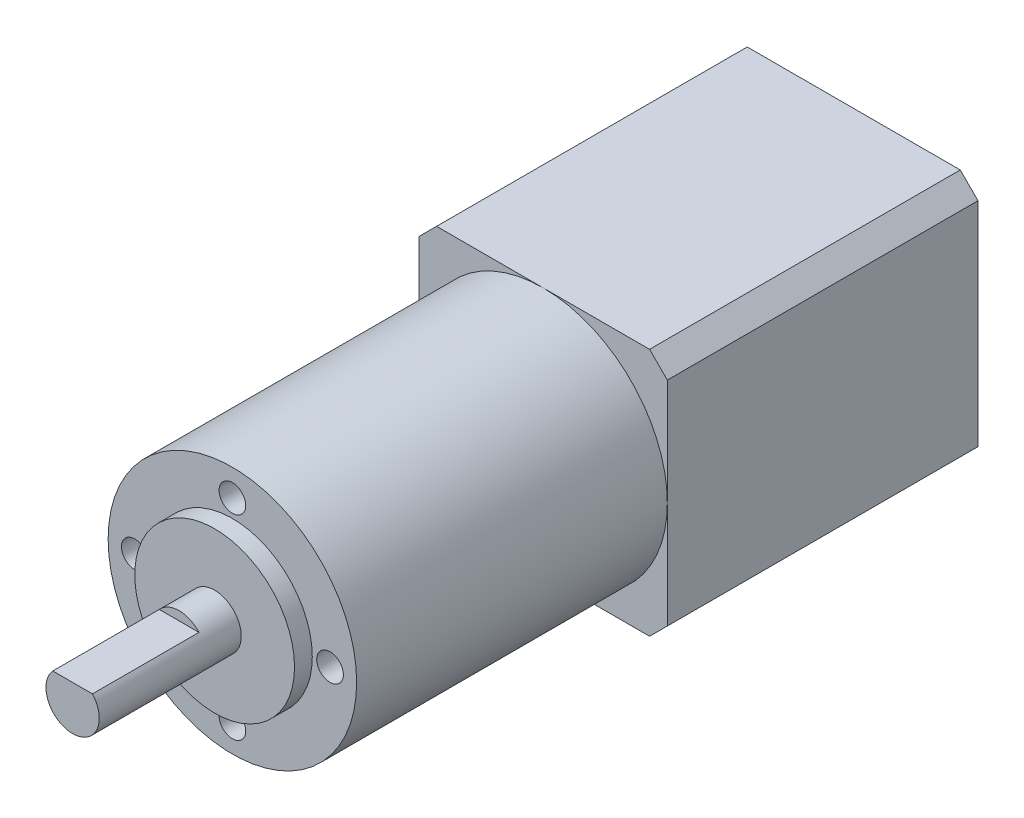
ISO-10303-21;
HEADER;
FILE_DESCRIPTION(('STEP AP214'),'2;1');
FILE_NAME('part.step','',(''),(''),'','','');
FILE_SCHEMA(('AUTOMOTIVE_DESIGN { 1 0 10303 214 1 1 1 1 }'));
ENDSEC;
DATA;
#1=APPLICATION_CONTEXT('core data for automotive mechanical design processes');
#2=APPLICATION_PROTOCOL_DEFINITION('international standard','automotive_design',2000,#1);
#3=PRODUCT_CONTEXT('',#1,'mechanical');
#4=PRODUCT('Part','Part','',(#3));
#5=PRODUCT_RELATED_PRODUCT_CATEGORY('part','',(#4));
#6=PRODUCT_DEFINITION_FORMATION('','',#4);
#7=PRODUCT_DEFINITION_CONTEXT('part definition',#1,'design');
#8=PRODUCT_DEFINITION('design','',#6,#7);
#9=PRODUCT_DEFINITION_SHAPE('','',#8);
#10=(LENGTH_UNIT() NAMED_UNIT(*) SI_UNIT(.MILLI.,.METRE.));
#11=(NAMED_UNIT(*) PLANE_ANGLE_UNIT() SI_UNIT($,.RADIAN.));
#12=(NAMED_UNIT(*) SI_UNIT($,.STERADIAN.) SOLID_ANGLE_UNIT());
#13=UNCERTAINTY_MEASURE_WITH_UNIT(LENGTH_MEASURE(1.E-05),#10,'distance_accuracy_value','');
#14=(GEOMETRIC_REPRESENTATION_CONTEXT(3) GLOBAL_UNCERTAINTY_ASSIGNED_CONTEXT((#13)) GLOBAL_UNIT_ASSIGNED_CONTEXT((#10,
#11,#12)) REPRESENTATION_CONTEXT('',''));
#15=CARTESIAN_POINT('',(0.,0.,0.));
#16=DIRECTION('',(0.,0.,1.));
#17=DIRECTION('',(1.,0.,0.));
#18=AXIS2_PLACEMENT_3D('',#15,#16,#17);
#19=CARTESIAN_POINT('',(0.,0.,35.));
#20=DIRECTION('',(0.,0.,-1.));
#21=DIRECTION('',(-1.,0.,0.));
#22=AXIS2_PLACEMENT_3D('',#19,#20,#21);
#23=PLANE('',#22);
#24=DIRECTION('',(0.,1.,0.));
#25=VECTOR('',#24,1.);
#26=CARTESIAN_POINT('',(14.,-14.,35.));
#27=LINE('',#26,#25);
#28=CARTESIAN_POINT('',(14.,0.,35.));
#29=VERTEX_POINT('',#28);
#30=CARTESIAN_POINT('',(14.,12.,35.));
#31=VERTEX_POINT('',#30);
#32=EDGE_CURVE('E176',#29,#31,#27,.T.);
#33=ORIENTED_EDGE('',*,*,#32,.T.);
#34=DIRECTION('',(0.707106781186545,-0.70710678118655,0.));
#35=VECTOR('',#34,1.);
#36=CARTESIAN_POINT('',(12.,14.,35.));
#37=LINE('',#36,#35);
#38=CARTESIAN_POINT('',(12.,14.,35.));
#39=VERTEX_POINT('',#38);
#40=EDGE_CURVE('E219',#31,#39,#37,.F.);
#41=ORIENTED_EDGE('',*,*,#40,.T.);
#42=DIRECTION('',(-1.,0.,0.));
#43=VECTOR('',#42,1.);
#44=CARTESIAN_POINT('',(-14.,14.,35.));
#45=LINE('',#44,#43);
#46=CARTESIAN_POINT('',(0.,14.,35.));
#47=VERTEX_POINT('',#46);
#48=EDGE_CURVE('E177',#39,#47,#45,.T.);
#49=ORIENTED_EDGE('',*,*,#48,.T.);
#50=CARTESIAN_POINT('',(0.,0.,35.));
#51=DIRECTION('',(0.,0.,1.));
#52=DIRECTION('',(1.,0.,0.));
#53=AXIS2_PLACEMENT_3D('',#50,#51,#52);
#54=CIRCLE('',#53,14.);
#55=EDGE_CURVE('E162',#29,#47,#54,.T.);
#56=ORIENTED_EDGE('',*,*,#55,.F.);
#57=EDGE_LOOP('',(#33,#41,#49,#56));
#58=FACE_BOUND('',#57,.T.);
#59=ADVANCED_FACE('F38',(#58),#23,.F.);
#60=CARTESIAN_POINT('',(-12.,14.,35.));
#61=VERTEX_POINT('',#60);
#62=EDGE_CURVE('E175',#47,#61,#45,.T.);
#63=ORIENTED_EDGE('',*,*,#62,.T.);
#64=DIRECTION('',(0.70710678118655,0.707106781186545,0.));
#65=VECTOR('',#64,1.);
#66=CARTESIAN_POINT('',(-14.,12.,35.));
#67=LINE('',#66,#65);
#68=CARTESIAN_POINT('',(-14.,12.,35.));
#69=VERTEX_POINT('',#68);
#70=EDGE_CURVE('E11',#61,#69,#67,.F.);
#71=ORIENTED_EDGE('',*,*,#70,.T.);
#72=DIRECTION('',(0.,-1.,0.));
#73=VECTOR('',#72,1.);
#74=CARTESIAN_POINT('',(-14.,-14.,35.));
#75=LINE('',#74,#73);
#76=CARTESIAN_POINT('',(-14.,0.,35.));
#77=VERTEX_POINT('',#76);
#78=EDGE_CURVE('E180',#69,#77,#75,.T.);
#79=ORIENTED_EDGE('',*,*,#78,.T.);
#80=EDGE_CURVE('E165',#47,#77,#54,.T.);
#81=ORIENTED_EDGE('',*,*,#80,.F.);
#82=EDGE_LOOP('',(#63,#71,#79,#81));
#83=FACE_BOUND('',#82,.T.);
#84=ADVANCED_FACE('F276',(#83),#23,.F.);
#85=CARTESIAN_POINT('',(-14.,-12.,35.));
#86=VERTEX_POINT('',#85);
#87=EDGE_CURVE('E179',#77,#86,#75,.T.);
#88=ORIENTED_EDGE('',*,*,#87,.T.);
#89=DIRECTION('',(-0.707106781186545,0.70710678118655,0.));
#90=VECTOR('',#89,1.);
#91=CARTESIAN_POINT('',(-12.,-14.,35.));
#92=LINE('',#91,#90);
#93=CARTESIAN_POINT('',(-12.,-14.,35.));
#94=VERTEX_POINT('',#93);
#95=EDGE_CURVE('E47',#86,#94,#92,.F.);
#96=ORIENTED_EDGE('',*,*,#95,.T.);
#97=DIRECTION('',(1.,0.,0.));
#98=VECTOR('',#97,1.);
#99=CARTESIAN_POINT('',(-14.,-14.,35.));
#100=LINE('',#99,#98);
#101=CARTESIAN_POINT('',(0.,-14.,35.));
#102=VERTEX_POINT('',#101);
#103=EDGE_CURVE('E183',#94,#102,#100,.T.);
#104=ORIENTED_EDGE('',*,*,#103,.T.);
#105=EDGE_CURVE('E271',#77,#102,#54,.T.);
#106=ORIENTED_EDGE('',*,*,#105,.F.);
#107=EDGE_LOOP('',(#88,#96,#104,#106));
#108=FACE_BOUND('',#107,.T.);
#109=ADVANCED_FACE('F227',(#108),#23,.F.);
#110=CARTESIAN_POINT('',(14.,-14.,35.));
#111=DIRECTION('',(-1.,0.,0.));
#112=DIRECTION('',(0.,0.,1.));
#113=AXIS2_PLACEMENT_3D('',#110,#111,#112);
#114=PLANE('',#113);
#115=CARTESIAN_POINT('',(14.,-12.,35.));
#116=VERTEX_POINT('',#115);
#117=EDGE_CURVE('E173',#116,#29,#27,.T.);
#118=ORIENTED_EDGE('',*,*,#117,.F.);
#119=DIRECTION('',(0.,0.,-1.));
#120=VECTOR('',#119,1.);
#121=CARTESIAN_POINT('',(14.,-12.,35.));
#122=LINE('',#121,#120);
#123=CARTESIAN_POINT('',(14.,-12.,0.));
#124=VERTEX_POINT('',#123);
#125=EDGE_CURVE('E196',#116,#124,#122,.T.);
#126=ORIENTED_EDGE('',*,*,#125,.T.);
#127=DIRECTION('',(0.,1.,0.));
#128=VECTOR('',#127,1.);
#129=CARTESIAN_POINT('',(14.,-14.,0.));
#130=LINE('',#129,#128);
#131=CARTESIAN_POINT('',(14.,12.,0.));
#132=VERTEX_POINT('',#131);
#133=EDGE_CURVE('E169',#124,#132,#130,.T.);
#134=ORIENTED_EDGE('',*,*,#133,.T.);
#135=DIRECTION('',(0.,0.,1.));
#136=VECTOR('',#135,1.);
#137=CARTESIAN_POINT('',(14.,12.,35.));
#138=LINE('',#137,#136);
#139=EDGE_CURVE('E158',#132,#31,#138,.T.);
#140=ORIENTED_EDGE('',*,*,#139,.T.);
#141=ORIENTED_EDGE('',*,*,#32,.F.);
#142=EDGE_LOOP('',(#118,#126,#134,#140,#141));
#143=FACE_BOUND('',#142,.T.);
#144=ADVANCED_FACE('F259',(#143),#114,.F.);
#145=CARTESIAN_POINT('',(-14.,14.,35.));
#146=DIRECTION('',(0.,-1.,0.));
#147=DIRECTION('',(1.,0.,0.));
#148=AXIS2_PLACEMENT_3D('',#145,#146,#147);
#149=PLANE('',#148);
#150=ORIENTED_EDGE('',*,*,#48,.F.);
#151=DIRECTION('',(0.,0.,-1.));
#152=VECTOR('',#151,1.);
#153=CARTESIAN_POINT('',(12.,14.,35.));
#154=LINE('',#153,#152);
#155=CARTESIAN_POINT('',(12.,14.,0.));
#156=VERTEX_POINT('',#155);
#157=EDGE_CURVE('E216',#39,#156,#154,.T.);
#158=ORIENTED_EDGE('',*,*,#157,.T.);
#159=DIRECTION('',(-1.,0.,0.));
#160=VECTOR('',#159,1.);
#161=CARTESIAN_POINT('',(-14.,14.,0.));
#162=LINE('',#161,#160);
#163=CARTESIAN_POINT('',(-12.,14.,0.));
#164=VERTEX_POINT('',#163);
#165=EDGE_CURVE('E187',#156,#164,#162,.T.);
#166=ORIENTED_EDGE('',*,*,#165,.T.);
#167=DIRECTION('',(0.,0.,1.));
#168=VECTOR('',#167,1.);
#169=CARTESIAN_POINT('',(-12.,14.,35.));
#170=LINE('',#169,#168);
#171=EDGE_CURVE('E214',#164,#61,#170,.T.);
#172=ORIENTED_EDGE('',*,*,#171,.T.);
#173=ORIENTED_EDGE('',*,*,#62,.F.);
#174=EDGE_LOOP('',(#150,#158,#166,#172,#173));
#175=FACE_BOUND('',#174,.T.);
#176=ADVANCED_FACE('F250',(#175),#149,.F.);
#177=CARTESIAN_POINT('',(-14.,-14.,35.));
#178=DIRECTION('',(1.,0.,0.));
#179=DIRECTION('',(0.,0.,-1.));
#180=AXIS2_PLACEMENT_3D('',#177,#178,#179);
#181=PLANE('',#180);
#182=DIRECTION('',(0.,-1.,0.));
#183=VECTOR('',#182,1.);
#184=CARTESIAN_POINT('',(-14.,-14.,0.));
#185=LINE('',#184,#183);
#186=CARTESIAN_POINT('',(-14.,12.,0.));
#187=VERTEX_POINT('',#186);
#188=CARTESIAN_POINT('',(-14.,-12.,0.));
#189=VERTEX_POINT('',#188);
#190=EDGE_CURVE('E190',#187,#189,#185,.T.);
#191=ORIENTED_EDGE('',*,*,#190,.T.);
#192=DIRECTION('',(0.,0.,1.));
#193=VECTOR('',#192,1.);
#194=CARTESIAN_POINT('',(-14.,-12.,35.));
#195=LINE('',#194,#193);
#196=EDGE_CURVE('E60',#189,#86,#195,.T.);
#197=ORIENTED_EDGE('',*,*,#196,.T.);
#198=ORIENTED_EDGE('',*,*,#87,.F.);
#199=ORIENTED_EDGE('',*,*,#78,.F.);
#200=DIRECTION('',(0.,0.,-1.));
#201=VECTOR('',#200,1.);
#202=CARTESIAN_POINT('',(-14.,12.,35.));
#203=LINE('',#202,#201);
#204=EDGE_CURVE('E221',#69,#187,#203,.T.);
#205=ORIENTED_EDGE('',*,*,#204,.T.);
#206=EDGE_LOOP('',(#191,#197,#198,#199,#205));
#207=FACE_BOUND('',#206,.T.);
#208=ADVANCED_FACE('F243',(#207),#181,.F.);
#209=CARTESIAN_POINT('',(-14.,-14.,35.));
#210=DIRECTION('',(0.,1.,0.));
#211=DIRECTION('',(0.,0.,1.));
#212=AXIS2_PLACEMENT_3D('',#209,#210,#211);
#213=PLANE('',#212);
#214=DIRECTION('',(1.,0.,0.));
#215=VECTOR('',#214,1.);
#216=CARTESIAN_POINT('',(-14.,-14.,0.));
#217=LINE('',#216,#215);
#218=CARTESIAN_POINT('',(-12.,-14.,0.));
#219=VERTEX_POINT('',#218);
#220=CARTESIAN_POINT('',(12.,-14.,0.));
#221=VERTEX_POINT('',#220);
#222=EDGE_CURVE('E192',#219,#221,#217,.T.);
#223=ORIENTED_EDGE('',*,*,#222,.T.);
#224=DIRECTION('',(0.,0.,1.));
#225=VECTOR('',#224,1.);
#226=CARTESIAN_POINT('',(12.,-14.,35.));
#227=LINE('',#226,#225);
#228=CARTESIAN_POINT('',(12.,-14.,35.));
#229=VERTEX_POINT('',#228);
#230=EDGE_CURVE('E210',#221,#229,#227,.T.);
#231=ORIENTED_EDGE('',*,*,#230,.T.);
#232=EDGE_CURVE('E182',#102,#229,#100,.T.);
#233=ORIENTED_EDGE('',*,*,#232,.F.);
#234=ORIENTED_EDGE('',*,*,#103,.F.);
#235=DIRECTION('',(0.,0.,-1.));
#236=VECTOR('',#235,1.);
#237=CARTESIAN_POINT('',(-12.,-14.,35.));
#238=LINE('',#237,#236);
#239=EDGE_CURVE('E207',#94,#219,#238,.T.);
#240=ORIENTED_EDGE('',*,*,#239,.T.);
#241=EDGE_LOOP('',(#223,#231,#233,#234,#240));
#242=FACE_BOUND('',#241,.T.);
#243=ADVANCED_FACE('F234',(#242),#213,.F.);
#244=ORIENTED_EDGE('',*,*,#232,.T.);
#245=DIRECTION('',(-0.70710678118655,-0.707106781186545,0.));
#246=VECTOR('',#245,1.);
#247=CARTESIAN_POINT('',(14.,-12.,35.));
#248=LINE('',#247,#246);
#249=EDGE_CURVE('E212',#229,#116,#248,.F.);
#250=ORIENTED_EDGE('',*,*,#249,.T.);
#251=ORIENTED_EDGE('',*,*,#117,.T.);
#252=EDGE_CURVE('E172',#102,#29,#54,.T.);
#253=ORIENTED_EDGE('',*,*,#252,.F.);
#254=EDGE_LOOP('',(#244,#250,#251,#253));
#255=FACE_BOUND('',#254,.T.);
#256=ADVANCED_FACE('F268',(#255),#23,.F.);
#257=CARTESIAN_POINT('',(0.,0.,0.));
#258=DIRECTION('',(0.,0.,-1.));
#259=DIRECTION('',(-1.,0.,0.));
#260=AXIS2_PLACEMENT_3D('',#257,#258,#259);
#261=PLANE('',#260);
#262=CARTESIAN_POINT('',(0.,0.,0.));
#263=DIRECTION('',(0.,0.,-1.));
#264=DIRECTION('',(-1.,0.,0.));
#265=AXIS2_PLACEMENT_3D('',#262,#263,#264);
#266=CIRCLE('',#265,2.5);
#267=CARTESIAN_POINT('',(-2.5,0.,0.));
#268=VERTEX_POINT('',#267);
#269=EDGE_CURVE('E410',#268,#268,#266,.T.);
#270=ORIENTED_EDGE('',*,*,#269,.F.);
#271=EDGE_LOOP('',(#270));
#272=FACE_BOUND('',#271,.T.);
#273=CARTESIAN_POINT('',(-9.5,0.,0.));
#274=DIRECTION('',(0.,0.,-1.));
#275=DIRECTION('',(-1.,0.,0.));
#276=AXIS2_PLACEMENT_3D('',#273,#274,#275);
#277=CIRCLE('',#276,1.5);
#278=CARTESIAN_POINT('',(-11.,0.,0.));
#279=VERTEX_POINT('',#278);
#280=EDGE_CURVE('E417',#279,#279,#277,.T.);
#281=ORIENTED_EDGE('',*,*,#280,.F.);
#282=EDGE_LOOP('',(#281));
#283=FACE_BOUND('',#282,.T.);
#284=CARTESIAN_POINT('',(9.5,0.,0.));
#285=DIRECTION('',(0.,0.,-1.));
#286=DIRECTION('',(1.,0.,0.));
#287=AXIS2_PLACEMENT_3D('',#284,#285,#286);
#288=CIRCLE('',#287,1.5);
#289=CARTESIAN_POINT('',(11.,0.,0.));
#290=VERTEX_POINT('',#289);
#291=EDGE_CURVE('E409',#290,#290,#288,.T.);
#292=ORIENTED_EDGE('',*,*,#291,.F.);
#293=EDGE_LOOP('',(#292));
#294=FACE_BOUND('',#293,.T.);
#295=ORIENTED_EDGE('',*,*,#133,.F.);
#296=DIRECTION('',(0.70710678118655,0.707106781186545,0.));
#297=VECTOR('',#296,1.);
#298=CARTESIAN_POINT('',(13.,-13.,0.));
#299=LINE('',#298,#297);
#300=EDGE_CURVE('E205',#124,#221,#299,.F.);
#301=ORIENTED_EDGE('',*,*,#300,.T.);
#302=ORIENTED_EDGE('',*,*,#222,.F.);
#303=DIRECTION('',(0.707106781186545,-0.70710678118655,0.));
#304=VECTOR('',#303,1.);
#305=CARTESIAN_POINT('',(-13.,-13.,0.));
#306=LINE('',#305,#304);
#307=EDGE_CURVE('E201',#219,#189,#306,.F.);
#308=ORIENTED_EDGE('',*,*,#307,.T.);
#309=ORIENTED_EDGE('',*,*,#190,.F.);
#310=DIRECTION('',(-0.70710678118655,-0.707106781186545,0.));
#311=VECTOR('',#310,1.);
#312=CARTESIAN_POINT('',(-13.,13.0000000000001,0.));
#313=LINE('',#312,#311);
#314=EDGE_CURVE('E199',#187,#164,#313,.F.);
#315=ORIENTED_EDGE('',*,*,#314,.T.);
#316=ORIENTED_EDGE('',*,*,#165,.F.);
#317=DIRECTION('',(-0.707106781186545,0.70710678118655,0.));
#318=VECTOR('',#317,1.);
#319=CARTESIAN_POINT('',(13.0000000000001,13.,0.));
#320=LINE('',#319,#318);
#321=EDGE_CURVE('E203',#156,#132,#320,.F.);
#322=ORIENTED_EDGE('',*,*,#321,.T.);
#323=EDGE_LOOP('',(#295,#301,#302,#308,#309,#315,#316,#322));
#324=FACE_BOUND('',#323,.T.);
#325=ADVANCED_FACE('F242',(#272,#283,#294,#324),#261,.T.);
#326=CARTESIAN_POINT('',(0.,0.,70.));
#327=DIRECTION('',(0.,0.,-1.));
#328=DIRECTION('',(-1.,0.,0.));
#329=AXIS2_PLACEMENT_3D('',#326,#327,#328);
#330=CYLINDRICAL_SURFACE('',#329,14.);
#331=CARTESIAN_POINT('',(0.,0.,70.));
#332=DIRECTION('',(0.,0.,1.));
#333=DIRECTION('',(1.,0.,0.));
#334=AXIS2_PLACEMENT_3D('',#331,#332,#333);
#335=CIRCLE('',#334,14.);
#336=CARTESIAN_POINT('',(14.,0.,70.));
#337=VERTEX_POINT('',#336);
#338=EDGE_CURVE('E166',#337,#337,#335,.T.);
#339=ORIENTED_EDGE('',*,*,#338,.F.);
#340=EDGE_LOOP('',(#339));
#341=FACE_BOUND('',#340,.T.);
#342=ORIENTED_EDGE('',*,*,#55,.T.);
#343=ORIENTED_EDGE('',*,*,#80,.T.);
#344=ORIENTED_EDGE('',*,*,#105,.T.);
#345=ORIENTED_EDGE('',*,*,#252,.T.);
#346=EDGE_LOOP('',(#342,#343,#344,#345));
#347=FACE_BOUND('',#346,.T.);
#348=ADVANCED_FACE('F274',(#341,#347),#330,.T.);
#349=CARTESIAN_POINT('',(0.,0.,70.));
#350=DIRECTION('',(0.,0.,1.));
#351=DIRECTION('',(1.,0.,0.));
#352=AXIS2_PLACEMENT_3D('',#349,#350,#351);
#353=PLANE('',#352);
#354=CARTESIAN_POINT('',(0.,11.,70.));
#355=DIRECTION('',(0.,0.,1.));
#356=DIRECTION('',(1.,0.,0.));
#357=AXIS2_PLACEMENT_3D('',#354,#355,#356);
#358=CIRCLE('',#357,1.5);
#359=CARTESIAN_POINT('',(1.5,11.,70.));
#360=VERTEX_POINT('',#359);
#361=EDGE_CURVE('E383',#360,#360,#358,.T.);
#362=ORIENTED_EDGE('',*,*,#361,.F.);
#363=EDGE_LOOP('',(#362));
#364=FACE_BOUND('',#363,.T.);
#365=CARTESIAN_POINT('',(11.,0.,70.));
#366=DIRECTION('',(0.,0.,1.));
#367=DIRECTION('',(1.,0.,0.));
#368=AXIS2_PLACEMENT_3D('',#365,#366,#367);
#369=CIRCLE('',#368,1.50000000000004);
#370=CARTESIAN_POINT('',(12.5,0.,70.));
#371=VERTEX_POINT('',#370);
#372=EDGE_CURVE('E387',#371,#371,#369,.T.);
#373=ORIENTED_EDGE('',*,*,#372,.F.);
#374=EDGE_LOOP('',(#373));
#375=FACE_BOUND('',#374,.T.);
#376=CARTESIAN_POINT('',(0.,-11.,70.));
#377=DIRECTION('',(0.,0.,1.));
#378=DIRECTION('',(1.,0.,0.));
#379=AXIS2_PLACEMENT_3D('',#376,#377,#378);
#380=CIRCLE('',#379,1.50000000000007);
#381=CARTESIAN_POINT('',(1.50000000000008,-11.,70.));
#382=VERTEX_POINT('',#381);
#383=EDGE_CURVE('E391',#382,#382,#380,.T.);
#384=ORIENTED_EDGE('',*,*,#383,.F.);
#385=EDGE_LOOP('',(#384));
#386=FACE_BOUND('',#385,.T.);
#387=CARTESIAN_POINT('',(-11.,0.,70.));
#388=DIRECTION('',(0.,0.,1.));
#389=DIRECTION('',(1.,0.,0.));
#390=AXIS2_PLACEMENT_3D('',#387,#388,#389);
#391=CIRCLE('',#390,1.50000000000011);
#392=CARTESIAN_POINT('',(-9.49999999999989,0.,70.));
#393=VERTEX_POINT('',#392);
#394=EDGE_CURVE('E395',#393,#393,#391,.T.);
#395=ORIENTED_EDGE('',*,*,#394,.F.);
#396=EDGE_LOOP('',(#395));
#397=FACE_BOUND('',#396,.T.);
#398=CARTESIAN_POINT('',(0.,0.,70.));
#399=DIRECTION('',(0.,0.,1.));
#400=DIRECTION('',(1.,0.,0.));
#401=AXIS2_PLACEMENT_3D('',#398,#399,#400);
#402=CIRCLE('',#401,9.);
#403=CARTESIAN_POINT('',(9.,0.,70.));
#404=VERTEX_POINT('',#403);
#405=EDGE_CURVE('E159',#404,#404,#402,.T.);
#406=ORIENTED_EDGE('',*,*,#405,.F.);
#407=EDGE_LOOP('',(#406));
#408=FACE_BOUND('',#407,.T.);
#409=ORIENTED_EDGE('',*,*,#338,.T.);
#410=EDGE_LOOP('',(#409));
#411=FACE_BOUND('',#410,.T.);
#412=ADVANCED_FACE('F372',(#364,#375,#386,#397,#408,#411),#353,.T.);
#413=CARTESIAN_POINT('',(0.,0.,72.));
#414=DIRECTION('',(0.,0.,-1.));
#415=DIRECTION('',(-1.,0.,0.));
#416=AXIS2_PLACEMENT_3D('',#413,#414,#415);
#417=CYLINDRICAL_SURFACE('',#416,9.);
#418=CARTESIAN_POINT('',(0.,0.,72.));
#419=DIRECTION('',(0.,0.,1.));
#420=DIRECTION('',(1.,0.,0.));
#421=AXIS2_PLACEMENT_3D('',#418,#419,#420);
#422=CIRCLE('',#421,9.);
#423=CARTESIAN_POINT('',(9.,0.,72.));
#424=VERTEX_POINT('',#423);
#425=EDGE_CURVE('E154',#424,#424,#422,.T.);
#426=ORIENTED_EDGE('',*,*,#425,.F.);
#427=EDGE_LOOP('',(#426));
#428=FACE_BOUND('',#427,.T.);
#429=ORIENTED_EDGE('',*,*,#405,.T.);
#430=EDGE_LOOP('',(#429));
#431=FACE_BOUND('',#430,.T.);
#432=ADVANCED_FACE('F369',(#428,#431),#417,.T.);
#433=CARTESIAN_POINT('',(0.,0.,72.));
#434=DIRECTION('',(0.,0.,1.));
#435=DIRECTION('',(1.,0.,0.));
#436=AXIS2_PLACEMENT_3D('',#433,#434,#435);
#437=PLANE('',#436);
#438=CARTESIAN_POINT('',(0.,0.,72.));
#439=DIRECTION('',(0.,0.,1.));
#440=DIRECTION('',(1.,0.,0.));
#441=AXIS2_PLACEMENT_3D('',#438,#439,#440);
#442=CIRCLE('',#441,3.);
#443=CARTESIAN_POINT('',(3.,0.,72.));
#444=VERTEX_POINT('',#443);
#445=EDGE_CURVE('E155',#444,#444,#442,.T.);
#446=ORIENTED_EDGE('',*,*,#445,.F.);
#447=EDGE_LOOP('',(#446));
#448=FACE_BOUND('',#447,.T.);
#449=ORIENTED_EDGE('',*,*,#425,.T.);
#450=EDGE_LOOP('',(#449));
#451=FACE_BOUND('',#450,.T.);
#452=ADVANCED_FACE('F366',(#448,#451),#437,.T.);
#453=CARTESIAN_POINT('',(0.,0.,88.));
#454=DIRECTION('',(0.,0.,-1.));
#455=DIRECTION('',(-1.,0.,0.));
#456=AXIS2_PLACEMENT_3D('',#453,#454,#455);
#457=CYLINDRICAL_SURFACE('',#456,3.);
#458=CARTESIAN_POINT('',(0.,0.,88.));
#459=DIRECTION('',(0.,0.,1.));
#460=DIRECTION('',(1.,0.,0.));
#461=AXIS2_PLACEMENT_3D('',#458,#459,#460);
#462=CIRCLE('',#461,3.);
#463=CARTESIAN_POINT('',(-2.23606797749979,2.,88.));
#464=VERTEX_POINT('',#463);
#465=CARTESIAN_POINT('',(2.23606797749979,2.,88.));
#466=VERTEX_POINT('',#465);
#467=EDGE_CURVE('E148',#464,#466,#462,.T.);
#468=ORIENTED_EDGE('',*,*,#467,.F.);
#469=DIRECTION('',(0.,0.,1.));
#470=VECTOR('',#469,1.);
#471=CARTESIAN_POINT('',(-2.23606797749979,2.,76.));
#472=LINE('',#471,#470);
#473=CARTESIAN_POINT('',(-2.23606797749979,2.,76.));
#474=VERTEX_POINT('',#473);
#475=EDGE_CURVE('E140',#474,#464,#472,.T.);
#476=ORIENTED_EDGE('',*,*,#475,.F.);
#477=CARTESIAN_POINT('',(0.,0.,76.));
#478=DIRECTION('',(0.,0.,1.));
#479=DIRECTION('',(-1.,0.,0.));
#480=AXIS2_PLACEMENT_3D('',#477,#478,#479);
#481=CIRCLE('',#480,3.);
#482=CARTESIAN_POINT('',(2.23606797749979,2.,76.));
#483=VERTEX_POINT('',#482);
#484=EDGE_CURVE('E129',#483,#474,#481,.T.);
#485=ORIENTED_EDGE('',*,*,#484,.F.);
#486=DIRECTION('',(0.,0.,1.));
#487=VECTOR('',#486,1.);
#488=CARTESIAN_POINT('',(2.23606797749979,2.,76.));
#489=LINE('',#488,#487);
#490=EDGE_CURVE('E142',#483,#466,#489,.T.);
#491=ORIENTED_EDGE('',*,*,#490,.T.);
#492=EDGE_LOOP('',(#468,#476,#485,#491));
#493=FACE_BOUND('',#492,.T.);
#494=ORIENTED_EDGE('',*,*,#445,.T.);
#495=EDGE_LOOP('',(#494));
#496=FACE_BOUND('',#495,.T.);
#497=ADVANCED_FACE('F145',(#493,#496),#457,.T.);
#498=CARTESIAN_POINT('',(0.,0.,88.));
#499=DIRECTION('',(0.,0.,1.));
#500=DIRECTION('',(1.,0.,0.));
#501=AXIS2_PLACEMENT_3D('',#498,#499,#500);
#502=PLANE('',#501);
#503=DIRECTION('',(1.,0.,0.));
#504=VECTOR('',#503,1.);
#505=CARTESIAN_POINT('',(-2.23606797749979,2.,88.));
#506=LINE('',#505,#504);
#507=EDGE_CURVE('E136',#464,#466,#506,.T.);
#508=ORIENTED_EDGE('',*,*,#507,.F.);
#509=ORIENTED_EDGE('',*,*,#467,.T.);
#510=EDGE_LOOP('',(#508,#509));
#511=FACE_BOUND('',#510,.T.);
#512=ADVANCED_FACE('F360',(#511),#502,.T.);
#513=CARTESIAN_POINT('',(-2.23606797749979,2.,76.));
#514=DIRECTION('',(0.,-1.,0.));
#515=DIRECTION('',(0.,0.,-1.));
#516=AXIS2_PLACEMENT_3D('',#513,#514,#515);
#517=PLANE('',#516);
#518=ORIENTED_EDGE('',*,*,#507,.T.);
#519=ORIENTED_EDGE('',*,*,#490,.F.);
#520=DIRECTION('',(1.,0.,0.));
#521=VECTOR('',#520,1.);
#522=CARTESIAN_POINT('',(-2.23606797749979,2.,76.));
#523=LINE('',#522,#521);
#524=EDGE_CURVE('E132',#474,#483,#523,.T.);
#525=ORIENTED_EDGE('',*,*,#524,.F.);
#526=ORIENTED_EDGE('',*,*,#475,.T.);
#527=EDGE_LOOP('',(#518,#519,#525,#526));
#528=FACE_BOUND('',#527,.T.);
#529=ADVANCED_FACE('F139',(#528),#517,.F.);
#530=CARTESIAN_POINT('',(0.,0.,76.));
#531=DIRECTION('',(0.,0.,-1.));
#532=DIRECTION('',(-1.,0.,0.));
#533=AXIS2_PLACEMENT_3D('',#530,#531,#532);
#534=PLANE('',#533);
#535=ORIENTED_EDGE('',*,*,#484,.T.);
#536=ORIENTED_EDGE('',*,*,#524,.T.);
#537=EDGE_LOOP('',(#535,#536));
#538=FACE_BOUND('',#537,.T.);
#539=ADVANCED_FACE('F131',(#538),#534,.F.);
#540=CARTESIAN_POINT('',(9.5,0.,2.));
#541=DIRECTION('',(0.,0.,-1.));
#542=DIRECTION('',(-1.,0.,0.));
#543=AXIS2_PLACEMENT_3D('',#540,#541,#542);
#544=CYLINDRICAL_SURFACE('',#543,1.5);
#545=CARTESIAN_POINT('',(9.5,0.,2.));
#546=DIRECTION('',(0.,0.,-1.));
#547=DIRECTION('',(1.,0.,0.));
#548=AXIS2_PLACEMENT_3D('',#545,#546,#547);
#549=CIRCLE('',#548,1.5);
#550=CARTESIAN_POINT('',(11.,0.,2.));
#551=VERTEX_POINT('',#550);
#552=EDGE_CURVE('E420',#551,#551,#549,.T.);
#553=ORIENTED_EDGE('',*,*,#552,.F.);
#554=EDGE_LOOP('',(#553));
#555=FACE_BOUND('',#554,.T.);
#556=ORIENTED_EDGE('',*,*,#291,.T.);
#557=EDGE_LOOP('',(#556));
#558=FACE_BOUND('',#557,.T.);
#559=ADVANCED_FACE('F351',(#555,#558),#544,.F.);
#560=CARTESIAN_POINT('',(9.5,0.,2.));
#561=DIRECTION('',(0.,0.,1.));
#562=DIRECTION('',(1.,0.,0.));
#563=AXIS2_PLACEMENT_3D('',#560,#561,#562);
#564=PLANE('',#563);
#565=ORIENTED_EDGE('',*,*,#552,.T.);
#566=EDGE_LOOP('',(#565));
#567=FACE_BOUND('',#566,.T.);
#568=ADVANCED_FACE('F347',(#567),#564,.F.);
#569=CARTESIAN_POINT('',(-9.5,0.,2.));
#570=DIRECTION('',(0.,0.,-1.));
#571=DIRECTION('',(-1.,0.,0.));
#572=AXIS2_PLACEMENT_3D('',#569,#570,#571);
#573=CYLINDRICAL_SURFACE('',#572,1.5);
#574=CARTESIAN_POINT('',(-9.5,0.,2.));
#575=DIRECTION('',(0.,0.,-1.));
#576=DIRECTION('',(-1.,0.,0.));
#577=AXIS2_PLACEMENT_3D('',#574,#575,#576);
#578=CIRCLE('',#577,1.5);
#579=CARTESIAN_POINT('',(-11.,0.,2.));
#580=VERTEX_POINT('',#579);
#581=EDGE_CURVE('E414',#580,#580,#578,.T.);
#582=ORIENTED_EDGE('',*,*,#581,.F.);
#583=EDGE_LOOP('',(#582));
#584=FACE_BOUND('',#583,.T.);
#585=ORIENTED_EDGE('',*,*,#280,.T.);
#586=EDGE_LOOP('',(#585));
#587=FACE_BOUND('',#586,.T.);
#588=ADVANCED_FACE('F343',(#584,#587),#573,.F.);
#589=CARTESIAN_POINT('',(-9.5,0.,2.));
#590=DIRECTION('',(0.,0.,-1.));
#591=DIRECTION('',(-1.,0.,0.));
#592=AXIS2_PLACEMENT_3D('',#589,#590,#591);
#593=PLANE('',#592);
#594=ORIENTED_EDGE('',*,*,#581,.T.);
#595=EDGE_LOOP('',(#594));
#596=FACE_BOUND('',#595,.T.);
#597=ADVANCED_FACE('F339',(#596),#593,.T.);
#598=CARTESIAN_POINT('',(0.,0.,-9.5));
#599=DIRECTION('',(0.,0.,1.));
#600=DIRECTION('',(1.,0.,0.));
#601=AXIS2_PLACEMENT_3D('',#598,#599,#600);
#602=CYLINDRICAL_SURFACE('',#601,2.5);
#603=CARTESIAN_POINT('',(0.,0.,-9.5));
#604=DIRECTION('',(0.,0.,-1.));
#605=DIRECTION('',(-1.,0.,0.));
#606=AXIS2_PLACEMENT_3D('',#603,#604,#605);
#607=CIRCLE('',#606,2.5);
#608=CARTESIAN_POINT('',(-2.5,0.,-9.5));
#609=VERTEX_POINT('',#608);
#610=EDGE_CURVE('E406',#609,#609,#607,.T.);
#611=ORIENTED_EDGE('',*,*,#610,.F.);
#612=EDGE_LOOP('',(#611));
#613=FACE_BOUND('',#612,.T.);
#614=ORIENTED_EDGE('',*,*,#269,.T.);
#615=EDGE_LOOP('',(#614));
#616=FACE_BOUND('',#615,.T.);
#617=ADVANCED_FACE('F335',(#613,#616),#602,.T.);
#618=CARTESIAN_POINT('',(0.,0.,-9.5));
#619=DIRECTION('',(0.,0.,-1.));
#620=DIRECTION('',(-1.,0.,0.));
#621=AXIS2_PLACEMENT_3D('',#618,#619,#620);
#622=PLANE('',#621);
#623=ORIENTED_EDGE('',*,*,#610,.T.);
#624=EDGE_LOOP('',(#623));
#625=FACE_BOUND('',#624,.T.);
#626=ADVANCED_FACE('F305',(#625),#622,.T.);
#627=CARTESIAN_POINT('',(14.,-12.,35.));
#628=DIRECTION('',(-0.707106781186545,0.70710678118655,0.));
#629=DIRECTION('',(0.,0.,-1.));
#630=AXIS2_PLACEMENT_3D('',#627,#628,#629);
#631=PLANE('',#630);
#632=ORIENTED_EDGE('',*,*,#249,.F.);
#633=ORIENTED_EDGE('',*,*,#230,.F.);
#634=ORIENTED_EDGE('',*,*,#300,.F.);
#635=ORIENTED_EDGE('',*,*,#125,.F.);
#636=EDGE_LOOP('',(#632,#633,#634,#635));
#637=FACE_BOUND('',#636,.T.);
#638=ADVANCED_FACE('F265',(#637),#631,.F.);
#639=CARTESIAN_POINT('',(12.,14.,35.));
#640=DIRECTION('',(-0.70710678118655,-0.707106781186545,0.));
#641=DIRECTION('',(0.,0.,-1.));
#642=AXIS2_PLACEMENT_3D('',#639,#640,#641);
#643=PLANE('',#642);
#644=ORIENTED_EDGE('',*,*,#40,.F.);
#645=ORIENTED_EDGE('',*,*,#139,.F.);
#646=ORIENTED_EDGE('',*,*,#321,.F.);
#647=ORIENTED_EDGE('',*,*,#157,.F.);
#648=EDGE_LOOP('',(#644,#645,#646,#647));
#649=FACE_BOUND('',#648,.T.);
#650=ADVANCED_FACE('F255',(#649),#643,.F.);
#651=CARTESIAN_POINT('',(-12.,-14.,35.));
#652=DIRECTION('',(0.70710678118655,0.707106781186545,0.));
#653=DIRECTION('',(0.,0.,-1.));
#654=AXIS2_PLACEMENT_3D('',#651,#652,#653);
#655=PLANE('',#654);
#656=ORIENTED_EDGE('',*,*,#95,.F.);
#657=ORIENTED_EDGE('',*,*,#196,.F.);
#658=ORIENTED_EDGE('',*,*,#307,.F.);
#659=ORIENTED_EDGE('',*,*,#239,.F.);
#660=EDGE_LOOP('',(#656,#657,#658,#659));
#661=FACE_BOUND('',#660,.T.);
#662=ADVANCED_FACE('F238',(#661),#655,.F.);
#663=CARTESIAN_POINT('',(-14.,12.,35.));
#664=DIRECTION('',(0.707106781186545,-0.70710678118655,0.));
#665=DIRECTION('',(0.,0.,-1.));
#666=AXIS2_PLACEMENT_3D('',#663,#664,#665);
#667=PLANE('',#666);
#668=ORIENTED_EDGE('',*,*,#70,.F.);
#669=ORIENTED_EDGE('',*,*,#171,.F.);
#670=ORIENTED_EDGE('',*,*,#314,.F.);
#671=ORIENTED_EDGE('',*,*,#204,.F.);
#672=EDGE_LOOP('',(#668,#669,#670,#671));
#673=FACE_BOUND('',#672,.T.);
#674=ADVANCED_FACE('F41',(#673),#667,.F.);
#675=CARTESIAN_POINT('',(-11.,0.,65.));
#676=DIRECTION('',(0.,0.,1.));
#677=DIRECTION('',(1.,0.,0.));
#678=AXIS2_PLACEMENT_3D('',#675,#676,#677);
#679=CYLINDRICAL_SURFACE('',#678,1.50000000000011);
#680=CARTESIAN_POINT('',(-11.,0.,65.));
#681=DIRECTION('',(0.,0.,1.));
#682=DIRECTION('',(1.,0.,0.));
#683=AXIS2_PLACEMENT_3D('',#680,#681,#682);
#684=CIRCLE('',#683,1.50000000000011);
#685=CARTESIAN_POINT('',(-9.49999999999989,0.,65.));
#686=VERTEX_POINT('',#685);
#687=EDGE_CURVE('E400',#686,#686,#684,.T.);
#688=ORIENTED_EDGE('',*,*,#687,.F.);
#689=EDGE_LOOP('',(#688));
#690=FACE_BOUND('',#689,.T.);
#691=ORIENTED_EDGE('',*,*,#394,.T.);
#692=EDGE_LOOP('',(#691));
#693=FACE_BOUND('',#692,.T.);
#694=ADVANCED_FACE('F316',(#690,#693),#679,.F.);
#695=CARTESIAN_POINT('',(-11.,0.,65.));
#696=DIRECTION('',(0.,0.,1.));
#697=DIRECTION('',(1.,0.,0.));
#698=AXIS2_PLACEMENT_3D('',#695,#696,#697);
#699=PLANE('',#698);
#700=ORIENTED_EDGE('',*,*,#687,.T.);
#701=EDGE_LOOP('',(#700));
#702=FACE_BOUND('',#701,.T.);
#703=ADVANCED_FACE('F320',(#702),#699,.T.);
#704=CARTESIAN_POINT('',(0.,-11.,65.));
#705=DIRECTION('',(0.,0.,1.));
#706=DIRECTION('',(1.,0.,0.));
#707=AXIS2_PLACEMENT_3D('',#704,#705,#706);
#708=CYLINDRICAL_SURFACE('',#707,1.50000000000007);
#709=CARTESIAN_POINT('',(0.,-11.,65.));
#710=DIRECTION('',(0.,0.,1.));
#711=DIRECTION('',(1.,0.,0.));
#712=AXIS2_PLACEMENT_3D('',#709,#710,#711);
#713=CIRCLE('',#712,1.50000000000007);
#714=CARTESIAN_POINT('',(1.50000000000008,-11.,65.));
#715=VERTEX_POINT('',#714);
#716=EDGE_CURVE('E444',#715,#715,#713,.T.);
#717=ORIENTED_EDGE('',*,*,#716,.F.);
#718=EDGE_LOOP('',(#717));
#719=FACE_BOUND('',#718,.T.);
#720=ORIENTED_EDGE('',*,*,#383,.T.);
#721=EDGE_LOOP('',(#720));
#722=FACE_BOUND('',#721,.T.);
#723=ADVANCED_FACE('F326',(#719,#722),#708,.F.);
#724=CARTESIAN_POINT('',(0.,-11.,65.));
#725=DIRECTION('',(0.,0.,1.));
#726=DIRECTION('',(1.,0.,0.));
#727=AXIS2_PLACEMENT_3D('',#724,#725,#726);
#728=PLANE('',#727);
#729=ORIENTED_EDGE('',*,*,#716,.T.);
#730=EDGE_LOOP('',(#729));
#731=FACE_BOUND('',#730,.T.);
#732=ADVANCED_FACE('F448',(#731),#728,.T.);
#733=CARTESIAN_POINT('',(11.,0.,65.));
#734=DIRECTION('',(0.,0.,1.));
#735=DIRECTION('',(1.,0.,0.));
#736=AXIS2_PLACEMENT_3D('',#733,#734,#735);
#737=CYLINDRICAL_SURFACE('',#736,1.50000000000004);
#738=CARTESIAN_POINT('',(11.,0.,65.));
#739=DIRECTION('',(0.,0.,1.));
#740=DIRECTION('',(1.,0.,0.));
#741=AXIS2_PLACEMENT_3D('',#738,#739,#740);
#742=CIRCLE('',#741,1.50000000000004);
#743=CARTESIAN_POINT('',(12.5,0.,65.));
#744=VERTEX_POINT('',#743);
#745=EDGE_CURVE('E438',#744,#744,#742,.T.);
#746=ORIENTED_EDGE('',*,*,#745,.F.);
#747=EDGE_LOOP('',(#746));
#748=FACE_BOUND('',#747,.T.);
#749=ORIENTED_EDGE('',*,*,#372,.T.);
#750=EDGE_LOOP('',(#749));
#751=FACE_BOUND('',#750,.T.);
#752=ADVANCED_FACE('F453',(#748,#751),#737,.F.);
#753=CARTESIAN_POINT('',(11.,0.,65.));
#754=DIRECTION('',(0.,0.,1.));
#755=DIRECTION('',(1.,0.,0.));
#756=AXIS2_PLACEMENT_3D('',#753,#754,#755);
#757=PLANE('',#756);
#758=ORIENTED_EDGE('',*,*,#745,.T.);
#759=EDGE_LOOP('',(#758));
#760=FACE_BOUND('',#759,.T.);
#761=ADVANCED_FACE('F460',(#760),#757,.T.);
#762=CARTESIAN_POINT('',(0.,11.,65.));
#763=DIRECTION('',(0.,0.,1.));
#764=DIRECTION('',(1.,0.,0.));
#765=AXIS2_PLACEMENT_3D('',#762,#763,#764);
#766=CYLINDRICAL_SURFACE('',#765,1.5);
#767=CARTESIAN_POINT('',(0.,11.,65.));
#768=DIRECTION('',(0.,0.,1.));
#769=DIRECTION('',(1.,0.,0.));
#770=AXIS2_PLACEMENT_3D('',#767,#768,#769);
#771=CIRCLE('',#770,1.5);
#772=CARTESIAN_POINT('',(1.5,11.,65.));
#773=VERTEX_POINT('',#772);
#774=EDGE_CURVE('E413',#773,#773,#771,.T.);
#775=ORIENTED_EDGE('',*,*,#774,.F.);
#776=EDGE_LOOP('',(#775));
#777=FACE_BOUND('',#776,.T.);
#778=ORIENTED_EDGE('',*,*,#361,.T.);
#779=EDGE_LOOP('',(#778));
#780=FACE_BOUND('',#779,.T.);
#781=ADVANCED_FACE('F464',(#777,#780),#766,.F.);
#782=CARTESIAN_POINT('',(0.,11.,65.));
#783=DIRECTION('',(0.,0.,1.));
#784=DIRECTION('',(1.,0.,0.));
#785=AXIS2_PLACEMENT_3D('',#782,#783,#784);
#786=PLANE('',#785);
#787=ORIENTED_EDGE('',*,*,#774,.T.);
#788=EDGE_LOOP('',(#787));
#789=FACE_BOUND('',#788,.T.);
#790=ADVANCED_FACE('F468',(#789),#786,.T.);
#791=CLOSED_SHELL('',(#59,#84,#109,#144,#176,#208,#243,#256,#325,#348,#412,#432,#452,#497,#512,
#529,#539,#559,#568,#588,#597,#617,#626,#638,#650,#662,#674,#694,#703,#723,#732,#752,#761,#781,#790));
#792=MANIFOLD_SOLID_BREP('B2',#791);
#793=ADVANCED_BREP_SHAPE_REPRESENTATION('',(#18,#792),#14);
#794=SHAPE_DEFINITION_REPRESENTATION(#9,#793);
ENDSEC;
END-ISO-10303-21;
